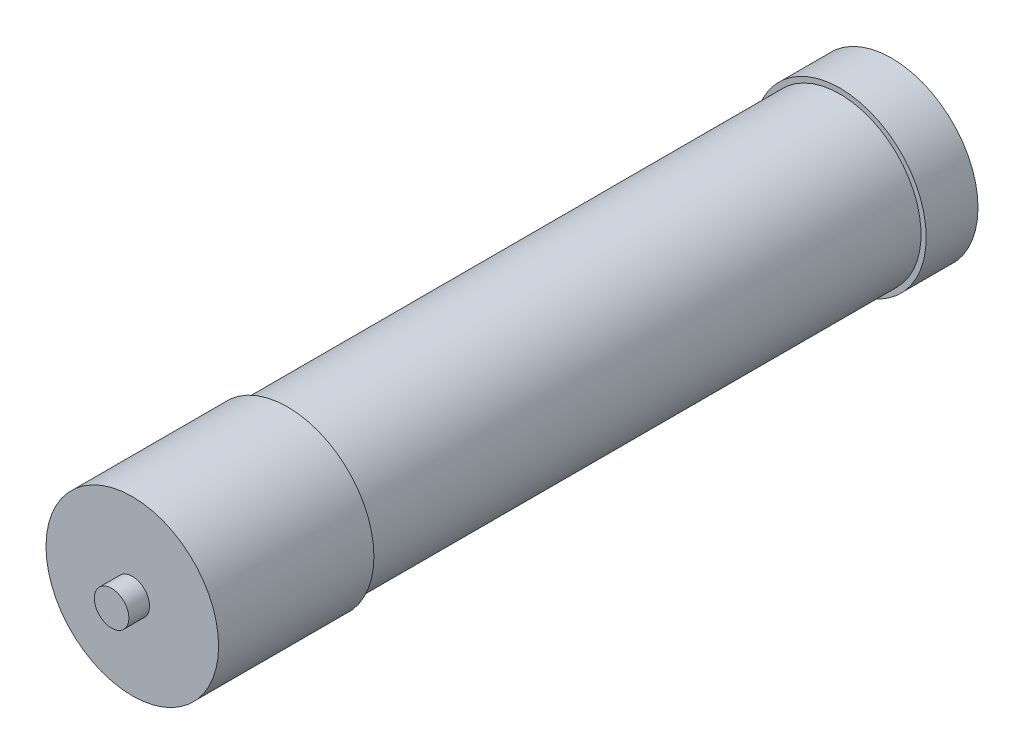
ISO-10303-21;
HEADER;
FILE_DESCRIPTION(('STEP AP214'),'2;1');
FILE_NAME('part.step','',(''),(''),'','','');
FILE_SCHEMA(('AUTOMOTIVE_DESIGN { 1 0 10303 214 1 1 1 1 }'));
ENDSEC;
DATA;
#1=APPLICATION_CONTEXT('core data for automotive mechanical design processes');
#2=APPLICATION_PROTOCOL_DEFINITION('international standard','automotive_design',2000,#1);
#3=PRODUCT_CONTEXT('',#1,'mechanical');
#4=PRODUCT('Part','Part','',(#3));
#5=PRODUCT_RELATED_PRODUCT_CATEGORY('part','',(#4));
#6=PRODUCT_DEFINITION_FORMATION('','',#4);
#7=PRODUCT_DEFINITION_CONTEXT('part definition',#1,'design');
#8=PRODUCT_DEFINITION('design','',#6,#7);
#9=PRODUCT_DEFINITION_SHAPE('','',#8);
#10=(LENGTH_UNIT() NAMED_UNIT(*) SI_UNIT(.MILLI.,.METRE.));
#11=(NAMED_UNIT(*) PLANE_ANGLE_UNIT() SI_UNIT($,.RADIAN.));
#12=(NAMED_UNIT(*) SI_UNIT($,.STERADIAN.) SOLID_ANGLE_UNIT());
#13=UNCERTAINTY_MEASURE_WITH_UNIT(LENGTH_MEASURE(1.E-05),#10,'distance_accuracy_value','');
#14=(GEOMETRIC_REPRESENTATION_CONTEXT(3) GLOBAL_UNCERTAINTY_ASSIGNED_CONTEXT((#13)) GLOBAL_UNIT_ASSIGNED_CONTEXT((#10,
#11,#12)) REPRESENTATION_CONTEXT('',''));
#15=CARTESIAN_POINT('',(0.,0.,0.));
#16=DIRECTION('',(0.,0.,1.));
#17=DIRECTION('',(1.,0.,0.));
#18=AXIS2_PLACEMENT_3D('',#15,#16,#17);
#19=CARTESIAN_POINT('',(0.,0.,110.));
#20=DIRECTION('',(0.,0.,-1.));
#21=DIRECTION('',(-1.,0.,0.));
#22=AXIS2_PLACEMENT_3D('',#19,#20,#21);
#23=CYLINDRICAL_SURFACE('',#22,23.5);
#24=CARTESIAN_POINT('',(0.,0.,65.));
#25=DIRECTION('',(0.,0.,1.));
#26=DIRECTION('',(1.,0.,0.));
#27=AXIS2_PLACEMENT_3D('',#24,#25,#26);
#28=CIRCLE('',#27,23.5);
#29=CARTESIAN_POINT('',(23.5,0.,65.));
#30=VERTEX_POINT('',#29);
#31=EDGE_CURVE('E46',#30,#30,#28,.T.);
#32=ORIENTED_EDGE('',*,*,#31,.F.);
#33=EDGE_LOOP('',(#32));
#34=FACE_BOUND('',#33,.T.);
#35=CARTESIAN_POINT('',(0.,0.,-95.));
#36=DIRECTION('',(0.,0.,-1.));
#37=DIRECTION('',(-1.,0.,0.));
#38=AXIS2_PLACEMENT_3D('',#35,#36,#37);
#39=CIRCLE('',#38,23.5);
#40=CARTESIAN_POINT('',(-23.5,0.,-95.));
#41=VERTEX_POINT('',#40);
#42=EDGE_CURVE('E11',#41,#41,#39,.T.);
#43=ORIENTED_EDGE('',*,*,#42,.F.);
#44=EDGE_LOOP('',(#43));
#45=FACE_BOUND('',#44,.T.);
#46=ADVANCED_FACE('F39',(#34,#45),#23,.T.);
#47=CARTESIAN_POINT('',(0.,0.,110.));
#48=DIRECTION('',(0.,0.,1.));
#49=DIRECTION('',(1.,0.,0.));
#50=AXIS2_PLACEMENT_3D('',#47,#48,#49);
#51=PLANE('',#50);
#52=CARTESIAN_POINT('',(0.,0.,110.));
#53=DIRECTION('',(0.,0.,1.));
#54=DIRECTION('',(1.,0.,0.));
#55=AXIS2_PLACEMENT_3D('',#52,#53,#54);
#56=CIRCLE('',#55,5.);
#57=CARTESIAN_POINT('',(5.,0.,110.));
#58=VERTEX_POINT('',#57);
#59=EDGE_CURVE('E109',#58,#58,#56,.T.);
#60=ORIENTED_EDGE('',*,*,#59,.F.);
#61=EDGE_LOOP('',(#60));
#62=FACE_BOUND('',#61,.T.);
#63=CARTESIAN_POINT('',(0.,0.,110.));
#64=DIRECTION('',(0.,0.,1.));
#65=DIRECTION('',(1.,0.,0.));
#66=AXIS2_PLACEMENT_3D('',#63,#64,#65);
#67=CIRCLE('',#66,25.);
#68=CARTESIAN_POINT('',(25.,0.,110.));
#69=VERTEX_POINT('',#68);
#70=EDGE_CURVE('E96',#69,#69,#67,.T.);
#71=ORIENTED_EDGE('',*,*,#70,.T.);
#72=EDGE_LOOP('',(#71));
#73=FACE_BOUND('',#72,.T.);
#74=ADVANCED_FACE('F120',(#62,#73),#51,.T.);
#75=CARTESIAN_POINT('',(0.,0.,116.));
#76=DIRECTION('',(0.,0.,-1.));
#77=DIRECTION('',(-1.,0.,0.));
#78=AXIS2_PLACEMENT_3D('',#75,#76,#77);
#79=CYLINDRICAL_SURFACE('',#78,5.);
#80=CARTESIAN_POINT('',(0.,0.,116.));
#81=DIRECTION('',(0.,0.,1.));
#82=DIRECTION('',(1.,0.,0.));
#83=AXIS2_PLACEMENT_3D('',#80,#81,#82);
#84=CIRCLE('',#83,5.);
#85=CARTESIAN_POINT('',(5.,0.,116.));
#86=VERTEX_POINT('',#85);
#87=EDGE_CURVE('E102',#86,#86,#84,.T.);
#88=ORIENTED_EDGE('',*,*,#87,.F.);
#89=EDGE_LOOP('',(#88));
#90=FACE_BOUND('',#89,.T.);
#91=ORIENTED_EDGE('',*,*,#59,.T.);
#92=EDGE_LOOP('',(#91));
#93=FACE_BOUND('',#92,.T.);
#94=ADVANCED_FACE('F149',(#90,#93),#79,.T.);
#95=CARTESIAN_POINT('',(0.,0.,116.));
#96=DIRECTION('',(0.,0.,1.));
#97=DIRECTION('',(1.,0.,0.));
#98=AXIS2_PLACEMENT_3D('',#95,#96,#97);
#99=PLANE('',#98);
#100=ORIENTED_EDGE('',*,*,#87,.T.);
#101=EDGE_LOOP('',(#100));
#102=FACE_BOUND('',#101,.T.);
#103=ADVANCED_FACE('F153',(#102),#99,.T.);
#104=CARTESIAN_POINT('',(0.,0.,65.));
#105=DIRECTION('',(0.,0.,1.));
#106=DIRECTION('',(1.,0.,0.));
#107=AXIS2_PLACEMENT_3D('',#104,#105,#106);
#108=CYLINDRICAL_SURFACE('',#107,25.);
#109=CARTESIAN_POINT('',(0.,0.,65.));
#110=DIRECTION('',(0.,0.,1.));
#111=DIRECTION('',(1.,0.,0.));
#112=AXIS2_PLACEMENT_3D('',#109,#110,#111);
#113=CIRCLE('',#112,25.);
#114=CARTESIAN_POINT('',(25.,0.,65.));
#115=VERTEX_POINT('',#114);
#116=EDGE_CURVE('E99',#115,#115,#113,.T.);
#117=CARTESIAN_POINT('',(25.,0.,65.));
#118=CARTESIAN_POINT('',(25.,0.,65.46875));
#119=CARTESIAN_POINT('',(25.,0.,65.9375));
#120=CARTESIAN_POINT('',(25.,0.,66.875));
#121=CARTESIAN_POINT('',(25.,0.,67.34375));
#122=CARTESIAN_POINT('',(25.,0.,68.28125));
#123=CARTESIAN_POINT('',(25.,0.,68.75));
#124=CARTESIAN_POINT('',(25.,0.,69.6875));
#125=CARTESIAN_POINT('',(25.,0.,70.15625));
#126=CARTESIAN_POINT('',(25.,0.,71.09375));
#127=CARTESIAN_POINT('',(25.,0.,71.5625));
#128=CARTESIAN_POINT('',(25.,0.,72.5));
#129=CARTESIAN_POINT('',(25.,0.,72.96875));
#130=CARTESIAN_POINT('',(25.,0.,73.90625));
#131=CARTESIAN_POINT('',(25.,0.,74.375));
#132=CARTESIAN_POINT('',(25.,0.,75.3125));
#133=CARTESIAN_POINT('',(25.,0.,75.78125));
#134=CARTESIAN_POINT('',(25.,0.,76.71875));
#135=CARTESIAN_POINT('',(25.,0.,77.1875));
#136=CARTESIAN_POINT('',(25.,0.,78.125));
#137=CARTESIAN_POINT('',(25.,0.,78.59375));
#138=CARTESIAN_POINT('',(25.,0.,79.53125));
#139=CARTESIAN_POINT('',(25.,0.,80.));
#140=CARTESIAN_POINT('',(25.,0.,80.9375));
#141=CARTESIAN_POINT('',(25.,0.,81.40625));
#142=CARTESIAN_POINT('',(25.,0.,82.34375));
#143=CARTESIAN_POINT('',(25.,0.,82.8125));
#144=CARTESIAN_POINT('',(25.,0.,83.75));
#145=CARTESIAN_POINT('',(25.,0.,84.21875));
#146=CARTESIAN_POINT('',(25.,0.,85.15625));
#147=CARTESIAN_POINT('',(25.,0.,85.625));
#148=CARTESIAN_POINT('',(25.,0.,86.5625));
#149=CARTESIAN_POINT('',(25.,0.,87.03125));
#150=CARTESIAN_POINT('',(25.,0.,87.96875));
#151=CARTESIAN_POINT('',(25.,0.,88.4375));
#152=CARTESIAN_POINT('',(25.,0.,89.375));
#153=CARTESIAN_POINT('',(25.,0.,89.84375));
#154=CARTESIAN_POINT('',(25.,0.,90.78125));
#155=CARTESIAN_POINT('',(25.,0.,91.25));
#156=CARTESIAN_POINT('',(25.,0.,92.1875));
#157=CARTESIAN_POINT('',(25.,0.,92.65625));
#158=CARTESIAN_POINT('',(25.,0.,93.59375));
#159=CARTESIAN_POINT('',(25.,0.,94.0625));
#160=CARTESIAN_POINT('',(25.,0.,95.));
#161=CARTESIAN_POINT('',(25.,0.,95.46875));
#162=CARTESIAN_POINT('',(25.,0.,96.40625));
#163=CARTESIAN_POINT('',(25.,0.,96.875));
#164=CARTESIAN_POINT('',(25.,0.,97.8125));
#165=CARTESIAN_POINT('',(25.,0.,98.28125));
#166=CARTESIAN_POINT('',(25.,0.,99.21875));
#167=CARTESIAN_POINT('',(25.,0.,99.6875));
#168=CARTESIAN_POINT('',(25.,0.,100.625));
#169=CARTESIAN_POINT('',(25.,0.,101.09375));
#170=CARTESIAN_POINT('',(25.,0.,102.03125));
#171=CARTESIAN_POINT('',(25.,0.,102.5));
#172=CARTESIAN_POINT('',(25.,0.,103.4375));
#173=CARTESIAN_POINT('',(25.,0.,103.90625));
#174=CARTESIAN_POINT('',(25.,0.,104.84375));
#175=CARTESIAN_POINT('',(25.,0.,105.3125));
#176=CARTESIAN_POINT('',(25.,0.,106.25));
#177=CARTESIAN_POINT('',(25.,0.,106.71875));
#178=CARTESIAN_POINT('',(25.,0.,107.65625));
#179=CARTESIAN_POINT('',(25.,0.,108.125));
#180=CARTESIAN_POINT('',(25.,0.,109.0625));
#181=CARTESIAN_POINT('',(25.,0.,109.53125));
#182=CARTESIAN_POINT('',(25.,0.,110.));
#183=B_SPLINE_CURVE_WITH_KNOTS('',3,(#117,#118,#119,#120,#121,#122,#123,#124,#125,#126,#127,
#128,#129,#130,#131,#132,#133,#134,#135,#136,#137,#138,#139,#140,#141,#142,#143,#144,#145,#146,
#147,#148,#149,#150,#151,#152,#153,#154,#155,#156,#157,#158,#159,#160,#161,#162,#163,#164,#165,
#166,#167,#168,#169,#170,#171,#172,#173,#174,#175,#176,#177,#178,#179,#180,#181,#182),
.UNSPECIFIED.,.F.,.F.,(4,2,2,2,2,2,2,2,2,2,2,2,2,2,2,2,2,2,2,2,2,2,2,2,2,2,2,2,2,2,2,2,4),(0.,
1.40625,2.8125,4.21874999999999,5.62499999999999,7.03124999999999,8.43749999999999,9.84375,
11.25,12.65625,14.0625,15.46875,16.875,18.28125,19.6875,21.09375,22.5,23.90625,25.3125,26.71875,
28.125,29.53125,30.9375,32.34375,33.75,35.15625,36.5625,37.96875,39.375,40.78125,42.1875,
43.59375,45.),.UNSPECIFIED.);
#184=EDGE_CURVE('BSEAM157',#115,#69,#183,.T.);
#185=ORIENTED_EDGE('',*,*,#116,.T.);
#186=ORIENTED_EDGE('',*,*,#70,.F.);
#187=ORIENTED_EDGE('',*,*,#184,.T.);
#188=ORIENTED_EDGE('',*,*,#184,.F.);
#189=EDGE_LOOP('',(#185,#187,#186,#188));
#190=FACE_BOUND('',#189,.T.);
#191=ADVANCED_FACE('F157',(#190),#108,.T.);
#192=CARTESIAN_POINT('',(0.,0.,65.));
#193=DIRECTION('',(0.,0.,1.));
#194=DIRECTION('',(1.,0.,0.));
#195=AXIS2_PLACEMENT_3D('',#192,#193,#194);
#196=PLANE('',#195);
#197=ORIENTED_EDGE('',*,*,#31,.T.);
#198=EDGE_LOOP('',(#197));
#199=FACE_BOUND('',#198,.T.);
#200=ORIENTED_EDGE('',*,*,#116,.F.);
#201=EDGE_LOOP('',(#200));
#202=FACE_BOUND('',#201,.T.);
#203=ADVANCED_FACE('F115',(#199,#202),#196,.F.);
#204=CARTESIAN_POINT('',(0.,0.,-95.));
#205=DIRECTION('',(0.,0.,-1.));
#206=DIRECTION('',(-1.,0.,0.));
#207=AXIS2_PLACEMENT_3D('',#204,#205,#206);
#208=CYLINDRICAL_SURFACE('',#207,25.);
#209=CARTESIAN_POINT('',(0.,0.,-95.));
#210=DIRECTION('',(0.,0.,-1.));
#211=DIRECTION('',(-1.,0.,0.));
#212=AXIS2_PLACEMENT_3D('',#209,#210,#211);
#213=CIRCLE('',#212,25.);
#214=CARTESIAN_POINT('',(-25.,0.,-95.));
#215=VERTEX_POINT('',#214);
#216=EDGE_CURVE('E93',#215,#215,#213,.T.);
#217=ORIENTED_EDGE('',*,*,#216,.T.);
#218=EDGE_LOOP('',(#217));
#219=FACE_BOUND('',#218,.T.);
#220=CARTESIAN_POINT('',(0.,0.,-110.));
#221=DIRECTION('',(0.,0.,-1.));
#222=DIRECTION('',(-1.,0.,0.));
#223=AXIS2_PLACEMENT_3D('',#220,#221,#222);
#224=CIRCLE('',#223,25.);
#225=CARTESIAN_POINT('',(-25.,0.,-110.));
#226=VERTEX_POINT('',#225);
#227=EDGE_CURVE('E92',#226,#226,#224,.T.);
#228=ORIENTED_EDGE('',*,*,#227,.F.);
#229=EDGE_LOOP('',(#228));
#230=FACE_BOUND('',#229,.T.);
#231=ADVANCED_FACE('F127',(#219,#230),#208,.T.);
#232=CARTESIAN_POINT('',(0.,0.,-95.));
#233=DIRECTION('',(0.,0.,-1.));
#234=DIRECTION('',(-1.,0.,0.));
#235=AXIS2_PLACEMENT_3D('',#232,#233,#234);
#236=PLANE('',#235);
#237=ORIENTED_EDGE('',*,*,#42,.T.);
#238=EDGE_LOOP('',(#237));
#239=FACE_BOUND('',#238,.T.);
#240=ORIENTED_EDGE('',*,*,#216,.F.);
#241=EDGE_LOOP('',(#240));
#242=FACE_BOUND('',#241,.T.);
#243=ADVANCED_FACE('F123',(#239,#242),#236,.F.);
#244=CARTESIAN_POINT('',(0.,0.,-110.));
#245=DIRECTION('',(0.,0.,1.));
#246=DIRECTION('',(1.,0.,0.));
#247=AXIS2_PLACEMENT_3D('',#244,#245,#246);
#248=PLANE('',#247);
#249=CARTESIAN_POINT('',(0.,17.5,-110.));
#250=DIRECTION('',(0.,0.,-1.));
#251=DIRECTION('',(-1.,0.,0.));
#252=AXIS2_PLACEMENT_3D('',#249,#250,#251);
#253=CIRCLE('',#252,1.64999999999999);
#254=CARTESIAN_POINT('',(-1.64999999999999,17.5,-110.));
#255=VERTEX_POINT('',#254);
#256=EDGE_CURVE('E70',#255,#255,#253,.T.);
#257=ORIENTED_EDGE('',*,*,#256,.F.);
#258=EDGE_LOOP('',(#257));
#259=FACE_BOUND('',#258,.T.);
#260=CARTESIAN_POINT('',(-17.5,0.,-110.));
#261=DIRECTION('',(0.,0.,-1.));
#262=DIRECTION('',(-1.,0.,0.));
#263=AXIS2_PLACEMENT_3D('',#260,#261,#262);
#264=CIRCLE('',#263,1.64999999999999);
#265=CARTESIAN_POINT('',(-19.15,0.,-110.));
#266=VERTEX_POINT('',#265);
#267=EDGE_CURVE('E69',#266,#266,#264,.T.);
#268=ORIENTED_EDGE('',*,*,#267,.F.);
#269=EDGE_LOOP('',(#268));
#270=FACE_BOUND('',#269,.T.);
#271=CARTESIAN_POINT('',(0.,-17.5,-110.));
#272=DIRECTION('',(0.,0.,-1.));
#273=DIRECTION('',(-1.,0.,0.));
#274=AXIS2_PLACEMENT_3D('',#271,#272,#273);
#275=CIRCLE('',#274,1.64999999999999);
#276=CARTESIAN_POINT('',(-1.64999999999999,-17.5,-110.));
#277=VERTEX_POINT('',#276);
#278=EDGE_CURVE('E80',#277,#277,#275,.T.);
#279=ORIENTED_EDGE('',*,*,#278,.F.);
#280=EDGE_LOOP('',(#279));
#281=FACE_BOUND('',#280,.T.);
#282=CARTESIAN_POINT('',(17.5,0.,-110.));
#283=DIRECTION('',(0.,0.,-1.));
#284=DIRECTION('',(-1.,0.,0.));
#285=AXIS2_PLACEMENT_3D('',#282,#283,#284);
#286=CIRCLE('',#285,1.64999999999999);
#287=CARTESIAN_POINT('',(15.85,0.,-110.));
#288=VERTEX_POINT('',#287);
#289=EDGE_CURVE('E86',#288,#288,#286,.T.);
#290=ORIENTED_EDGE('',*,*,#289,.F.);
#291=EDGE_LOOP('',(#290));
#292=FACE_BOUND('',#291,.T.);
#293=ORIENTED_EDGE('',*,*,#227,.T.);
#294=EDGE_LOOP('',(#293));
#295=FACE_BOUND('',#294,.T.);
#296=ADVANCED_FACE('F126',(#259,#270,#281,#292,#295),#248,.F.);
#297=CARTESIAN_POINT('',(17.5,0.,-90.));
#298=DIRECTION('',(0.,0.,-1.));
#299=DIRECTION('',(-1.,0.,0.));
#300=AXIS2_PLACEMENT_3D('',#297,#298,#299);
#301=CONICAL_SURFACE('',#300,1.65,1.02974425867665);
#302=CARTESIAN_POINT('',(17.5,0.,-89.0085799786045));
#303=VERTEX_POINT('',#302);
#304=VERTEX_LOOP('',#303);
#305=FACE_BOUND('',#304,.T.);
#306=CARTESIAN_POINT('',(17.5,0.,-90.));
#307=DIRECTION('',(0.,0.,-1.));
#308=DIRECTION('',(-1.,0.,0.));
#309=AXIS2_PLACEMENT_3D('',#306,#307,#308);
#310=CIRCLE('',#309,1.65);
#311=CARTESIAN_POINT('',(15.85,0.,-90.));
#312=VERTEX_POINT('',#311);
#313=EDGE_CURVE('E89',#312,#312,#310,.T.);
#314=ORIENTED_EDGE('',*,*,#313,.T.);
#315=EDGE_LOOP('',(#314));
#316=FACE_BOUND('',#315,.T.);
#317=ADVANCED_FACE('F137',(#305,#316),#301,.F.);
#318=CARTESIAN_POINT('',(17.5,0.,-110.));
#319=DIRECTION('',(0.,0.,-1.));
#320=DIRECTION('',(-1.,0.,0.));
#321=AXIS2_PLACEMENT_3D('',#318,#319,#320);
#322=CYLINDRICAL_SURFACE('',#321,1.64999999999999);
#323=ORIENTED_EDGE('',*,*,#313,.F.);
#324=EDGE_LOOP('',(#323));
#325=FACE_BOUND('',#324,.T.);
#326=ORIENTED_EDGE('',*,*,#289,.T.);
#327=EDGE_LOOP('',(#326));
#328=FACE_BOUND('',#327,.T.);
#329=ADVANCED_FACE('F142',(#325,#328),#322,.F.);
#330=CARTESIAN_POINT('',(0.,-17.5,-90.));
#331=DIRECTION('',(0.,0.,-1.));
#332=DIRECTION('',(-1.,0.,0.));
#333=AXIS2_PLACEMENT_3D('',#330,#331,#332);
#334=CONICAL_SURFACE('',#333,1.65,1.02974425867665);
#335=CARTESIAN_POINT('',(0.,-17.5,-89.0085799786045));
#336=VERTEX_POINT('',#335);
#337=VERTEX_LOOP('',#336);
#338=FACE_BOUND('',#337,.T.);
#339=CARTESIAN_POINT('',(0.,-17.5,-90.));
#340=DIRECTION('',(0.,0.,-1.));
#341=DIRECTION('',(-1.,0.,0.));
#342=AXIS2_PLACEMENT_3D('',#339,#340,#341);
#343=CIRCLE('',#342,1.65);
#344=CARTESIAN_POINT('',(-1.65,-17.5,-90.));
#345=VERTEX_POINT('',#344);
#346=EDGE_CURVE('E83',#345,#345,#343,.T.);
#347=ORIENTED_EDGE('',*,*,#346,.T.);
#348=EDGE_LOOP('',(#347));
#349=FACE_BOUND('',#348,.T.);
#350=ADVANCED_FACE('F166',(#338,#349),#334,.F.);
#351=CARTESIAN_POINT('',(0.,-17.5,-110.));
#352=DIRECTION('',(0.,0.,-1.));
#353=DIRECTION('',(-1.,0.,0.));
#354=AXIS2_PLACEMENT_3D('',#351,#352,#353);
#355=CYLINDRICAL_SURFACE('',#354,1.64999999999999);
#356=ORIENTED_EDGE('',*,*,#346,.F.);
#357=EDGE_LOOP('',(#356));
#358=FACE_BOUND('',#357,.T.);
#359=ORIENTED_EDGE('',*,*,#278,.T.);
#360=EDGE_LOOP('',(#359));
#361=FACE_BOUND('',#360,.T.);
#362=ADVANCED_FACE('F170',(#358,#361),#355,.F.);
#363=CARTESIAN_POINT('',(-17.5,0.,-90.));
#364=DIRECTION('',(0.,0.,-1.));
#365=DIRECTION('',(-1.,0.,0.));
#366=AXIS2_PLACEMENT_3D('',#363,#364,#365);
#367=CONICAL_SURFACE('',#366,1.65,1.02974425867665);
#368=CARTESIAN_POINT('',(-17.5,0.,-89.0085799786045));
#369=VERTEX_POINT('',#368);
#370=VERTEX_LOOP('',#369);
#371=FACE_BOUND('',#370,.T.);
#372=CARTESIAN_POINT('',(-17.5,0.,-90.));
#373=DIRECTION('',(0.,0.,-1.));
#374=DIRECTION('',(-1.,0.,0.));
#375=AXIS2_PLACEMENT_3D('',#372,#373,#374);
#376=CIRCLE('',#375,1.65);
#377=CARTESIAN_POINT('',(-19.15,0.,-90.));
#378=VERTEX_POINT('',#377);
#379=EDGE_CURVE('E73',#378,#378,#376,.T.);
#380=ORIENTED_EDGE('',*,*,#379,.T.);
#381=EDGE_LOOP('',(#380));
#382=FACE_BOUND('',#381,.T.);
#383=ADVANCED_FACE('F173',(#371,#382),#367,.F.);
#384=CARTESIAN_POINT('',(-17.5,0.,-110.));
#385=DIRECTION('',(0.,0.,-1.));
#386=DIRECTION('',(-1.,0.,0.));
#387=AXIS2_PLACEMENT_3D('',#384,#385,#386);
#388=CYLINDRICAL_SURFACE('',#387,1.64999999999999);
#389=ORIENTED_EDGE('',*,*,#379,.F.);
#390=EDGE_LOOP('',(#389));
#391=FACE_BOUND('',#390,.T.);
#392=ORIENTED_EDGE('',*,*,#267,.T.);
#393=EDGE_LOOP('',(#392));
#394=FACE_BOUND('',#393,.T.);
#395=ADVANCED_FACE('F63',(#391,#394),#388,.F.);
#396=CARTESIAN_POINT('',(0.,17.5,-90.));
#397=DIRECTION('',(0.,0.,-1.));
#398=DIRECTION('',(-1.,0.,0.));
#399=AXIS2_PLACEMENT_3D('',#396,#397,#398);
#400=CONICAL_SURFACE('',#399,1.65,1.02974425867665);
#401=CARTESIAN_POINT('',(0.,17.5,-89.0085799786045));
#402=VERTEX_POINT('',#401);
#403=VERTEX_LOOP('',#402);
#404=FACE_BOUND('',#403,.T.);
#405=CARTESIAN_POINT('',(0.,17.5,-90.));
#406=DIRECTION('',(0.,0.,-1.));
#407=DIRECTION('',(-1.,0.,0.));
#408=AXIS2_PLACEMENT_3D('',#405,#406,#407);
#409=CIRCLE('',#408,1.65);
#410=CARTESIAN_POINT('',(-1.65,17.5,-90.));
#411=VERTEX_POINT('',#410);
#412=EDGE_CURVE('E67',#411,#411,#409,.T.);
#413=ORIENTED_EDGE('',*,*,#412,.T.);
#414=EDGE_LOOP('',(#413));
#415=FACE_BOUND('',#414,.T.);
#416=ADVANCED_FACE('F59',(#404,#415),#400,.F.);
#417=CARTESIAN_POINT('',(0.,17.5,-110.));
#418=DIRECTION('',(0.,0.,-1.));
#419=DIRECTION('',(-1.,0.,0.));
#420=AXIS2_PLACEMENT_3D('',#417,#418,#419);
#421=CYLINDRICAL_SURFACE('',#420,1.64999999999999);
#422=ORIENTED_EDGE('',*,*,#412,.F.);
#423=EDGE_LOOP('',(#422));
#424=FACE_BOUND('',#423,.T.);
#425=ORIENTED_EDGE('',*,*,#256,.T.);
#426=EDGE_LOOP('',(#425));
#427=FACE_BOUND('',#426,.T.);
#428=ADVANCED_FACE('F62',(#424,#427),#421,.F.);
#429=CLOSED_SHELL('',(#46,#74,#94,#103,#191,#203,#231,#243,#296,#317,#329,#350,#362,#383,#395,
#416,#428));
#430=MANIFOLD_SOLID_BREP('B2',#429);
#431=ADVANCED_BREP_SHAPE_REPRESENTATION('',(#18,#430),#14);
#432=SHAPE_DEFINITION_REPRESENTATION(#9,#431);
ENDSEC;
END-ISO-10303-21;
